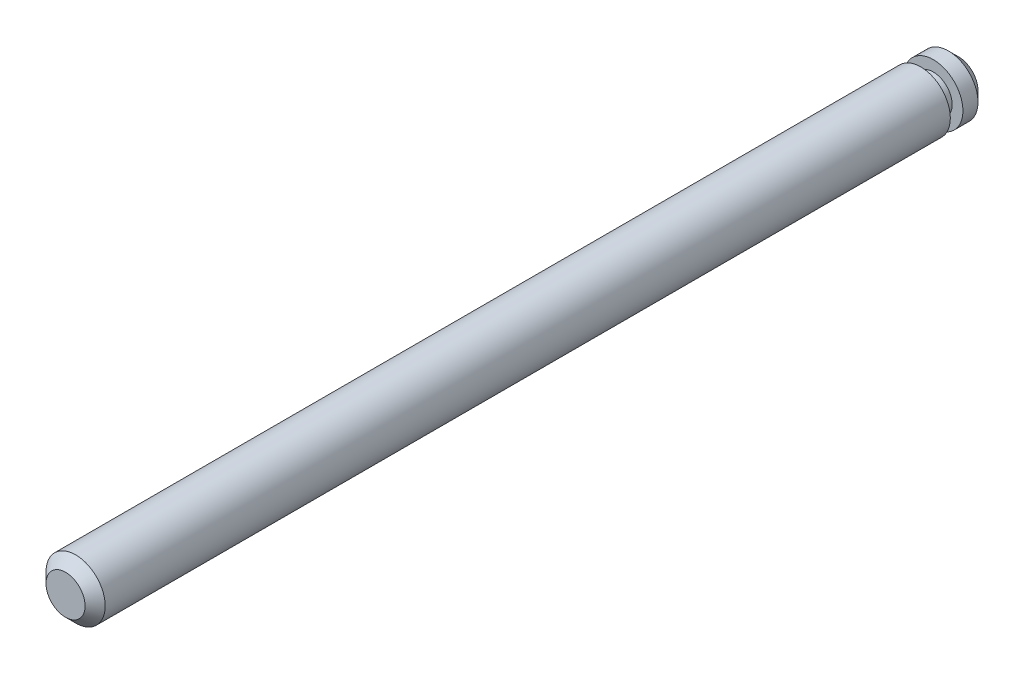
ISO-10303-21;
HEADER;
FILE_DESCRIPTION(('STEP AP214'),'2;1');
FILE_NAME('part.step','',(''),(''),'','','');
FILE_SCHEMA(('AUTOMOTIVE_DESIGN { 1 0 10303 214 1 1 1 1 }'));
ENDSEC;
DATA;
#1=APPLICATION_CONTEXT('core data for automotive mechanical design processes');
#2=APPLICATION_PROTOCOL_DEFINITION('international standard','automotive_design',2000,#1);
#3=PRODUCT_CONTEXT('',#1,'mechanical');
#4=PRODUCT('Part','Part','',(#3));
#5=PRODUCT_RELATED_PRODUCT_CATEGORY('part','',(#4));
#6=PRODUCT_DEFINITION_FORMATION('','',#4);
#7=PRODUCT_DEFINITION_CONTEXT('part definition',#1,'design');
#8=PRODUCT_DEFINITION('design','',#6,#7);
#9=PRODUCT_DEFINITION_SHAPE('','',#8);
#10=(LENGTH_UNIT() NAMED_UNIT(*) SI_UNIT(.MILLI.,.METRE.));
#11=(NAMED_UNIT(*) PLANE_ANGLE_UNIT() SI_UNIT($,.RADIAN.));
#12=(NAMED_UNIT(*) SI_UNIT($,.STERADIAN.) SOLID_ANGLE_UNIT());
#13=UNCERTAINTY_MEASURE_WITH_UNIT(LENGTH_MEASURE(1.E-05),#10,'distance_accuracy_value','');
#14=(GEOMETRIC_REPRESENTATION_CONTEXT(3) GLOBAL_UNCERTAINTY_ASSIGNED_CONTEXT((#13)) GLOBAL_UNIT_ASSIGNED_CONTEXT((#10,
#11,#12)) REPRESENTATION_CONTEXT('',''));
#15=CARTESIAN_POINT('',(0.,0.,0.));
#16=DIRECTION('',(0.,0.,1.));
#17=DIRECTION('',(1.,0.,0.));
#18=AXIS2_PLACEMENT_3D('',#15,#16,#17);
#19=CARTESIAN_POINT('',(0.,0.,0.));
#20=DIRECTION('',(0.,0.,1.));
#21=DIRECTION('',(1.,0.,0.));
#22=AXIS2_PLACEMENT_3D('',#19,#20,#21);
#23=PLANE('',#22);
#24=CARTESIAN_POINT('',(0.,0.,0.));
#25=DIRECTION('',(0.,0.,1.));
#26=DIRECTION('',(1.,0.,0.));
#27=AXIS2_PLACEMENT_3D('',#24,#25,#26);
#28=CIRCLE('',#27,1.49479);
#29=CARTESIAN_POINT('',(1.49479,0.,0.));
#30=VERTEX_POINT('',#29);
#31=EDGE_CURVE('E58',#30,#30,#28,.T.);
#32=ORIENTED_EDGE('',*,*,#31,.F.);
#33=EDGE_LOOP('',(#32));
#34=FACE_BOUND('',#33,.T.);
#35=CARTESIAN_POINT('',(0.,0.,0.));
#36=DIRECTION('',(0.,0.,1.));
#37=DIRECTION('',(1.,0.,0.));
#38=AXIS2_PLACEMENT_3D('',#35,#36,#37);
#39=CIRCLE('',#38,0.9525);
#40=CARTESIAN_POINT('',(0.9525,0.,0.));
#41=VERTEX_POINT('',#40);
#42=EDGE_CURVE('E55',#41,#41,#39,.F.);
#43=ORIENTED_EDGE('',*,*,#42,.F.);
#44=EDGE_LOOP('',(#43));
#45=FACE_BOUND('',#44,.T.);
#46=ADVANCED_FACE('F35',(#34,#45),#23,.F.);
#47=CARTESIAN_POINT('',(0.,0.,43.18));
#48=DIRECTION('',(0.,0.,-1.));
#49=DIRECTION('',(-1.,0.,0.));
#50=AXIS2_PLACEMENT_3D('',#47,#48,#49);
#51=CYLINDRICAL_SURFACE('',#50,1.49479);
#52=CARTESIAN_POINT('',(0.,0.,42.672));
#53=DIRECTION('',(0.,0.,1.));
#54=DIRECTION('',(1.,0.,0.));
#55=AXIS2_PLACEMENT_3D('',#52,#53,#54);
#56=CIRCLE('',#55,1.49479);
#57=CARTESIAN_POINT('',(1.49479,0.,42.672));
#58=VERTEX_POINT('',#57);
#59=EDGE_CURVE('E10',#58,#58,#56,.F.);
#60=ORIENTED_EDGE('',*,*,#59,.T.);
#61=EDGE_LOOP('',(#60));
#62=FACE_BOUND('',#61,.T.);
#63=ORIENTED_EDGE('',*,*,#31,.T.);
#64=EDGE_LOOP('',(#63));
#65=FACE_BOUND('',#64,.T.);
#66=ADVANCED_FACE('F84',(#62,#65),#51,.T.);
#67=CARTESIAN_POINT('',(0.,0.,43.18));
#68=DIRECTION('',(0.,0.,1.));
#69=DIRECTION('',(1.,0.,0.));
#70=AXIS2_PLACEMENT_3D('',#67,#68,#69);
#71=PLANE('',#70);
#72=CARTESIAN_POINT('',(0.,0.,43.18));
#73=DIRECTION('',(0.,0.,1.));
#74=DIRECTION('',(1.,0.,0.));
#75=AXIS2_PLACEMENT_3D('',#72,#73,#74);
#76=CIRCLE('',#75,0.986790000000001);
#77=CARTESIAN_POINT('',(0.986790000000001,0.,43.18));
#78=VERTEX_POINT('',#77);
#79=EDGE_CURVE('E42',#78,#78,#76,.T.);
#80=ORIENTED_EDGE('',*,*,#79,.T.);
#81=EDGE_LOOP('',(#80));
#82=FACE_BOUND('',#81,.T.);
#83=ADVANCED_FACE('F79',(#82),#71,.T.);
#84=CARTESIAN_POINT('',(0.,0.,-0.635));
#85=DIRECTION('',(0.,0.,1.));
#86=DIRECTION('',(1.,0.,0.));
#87=AXIS2_PLACEMENT_3D('',#84,#85,#86);
#88=CYLINDRICAL_SURFACE('',#87,0.9525);
#89=CARTESIAN_POINT('',(0.,0.,-0.635));
#90=DIRECTION('',(0.,0.,-1.));
#91=DIRECTION('',(-1.,0.,0.));
#92=AXIS2_PLACEMENT_3D('',#89,#90,#91);
#93=CIRCLE('',#92,0.9525);
#94=CARTESIAN_POINT('',(-0.9525,0.,-0.635));
#95=VERTEX_POINT('',#94);
#96=EDGE_CURVE('E61',#95,#95,#93,.T.);
#97=ORIENTED_EDGE('',*,*,#96,.F.);
#98=EDGE_LOOP('',(#97));
#99=FACE_BOUND('',#98,.T.);
#100=ORIENTED_EDGE('',*,*,#42,.T.);
#101=EDGE_LOOP('',(#100));
#102=FACE_BOUND('',#101,.T.);
#103=ADVANCED_FACE('F73',(#99,#102),#88,.T.);
#104=CARTESIAN_POINT('',(0.,0.,-0.635));
#105=DIRECTION('',(0.,0.,-1.));
#106=DIRECTION('',(-1.,0.,0.));
#107=AXIS2_PLACEMENT_3D('',#104,#105,#106);
#108=PLANE('',#107);
#109=CARTESIAN_POINT('',(0.,0.,-0.635));
#110=DIRECTION('',(0.,0.,-1.));
#111=DIRECTION('',(-1.,0.,0.));
#112=AXIS2_PLACEMENT_3D('',#109,#110,#111);
#113=CIRCLE('',#112,1.49479);
#114=CARTESIAN_POINT('',(-1.49479,0.,-0.635));
#115=VERTEX_POINT('',#114);
#116=EDGE_CURVE('E64',#115,#115,#113,.T.);
#117=ORIENTED_EDGE('',*,*,#116,.F.);
#118=EDGE_LOOP('',(#117));
#119=FACE_BOUND('',#118,.T.);
#120=ORIENTED_EDGE('',*,*,#96,.T.);
#121=EDGE_LOOP('',(#120));
#122=FACE_BOUND('',#121,.T.);
#123=ADVANCED_FACE('F70',(#119,#122),#108,.F.);
#124=CARTESIAN_POINT('',(0.,0.,-1.905));
#125=DIRECTION('',(0.,0.,1.));
#126=DIRECTION('',(1.,0.,0.));
#127=AXIS2_PLACEMENT_3D('',#124,#125,#126);
#128=CYLINDRICAL_SURFACE('',#127,1.49479);
#129=CARTESIAN_POINT('',(0.,0.,-1.397));
#130=DIRECTION('',(0.,0.,-1.));
#131=DIRECTION('',(-1.,0.,0.));
#132=AXIS2_PLACEMENT_3D('',#129,#130,#131);
#133=CIRCLE('',#132,1.49479);
#134=CARTESIAN_POINT('',(-1.49479,0.,-1.397));
#135=VERTEX_POINT('',#134);
#136=EDGE_CURVE('E46',#135,#135,#133,.F.);
#137=ORIENTED_EDGE('',*,*,#136,.T.);
#138=EDGE_LOOP('',(#137));
#139=FACE_BOUND('',#138,.T.);
#140=ORIENTED_EDGE('',*,*,#116,.T.);
#141=EDGE_LOOP('',(#140));
#142=FACE_BOUND('',#141,.T.);
#143=ADVANCED_FACE('F68',(#139,#142),#128,.T.);
#144=CARTESIAN_POINT('',(0.,0.,-1.905));
#145=DIRECTION('',(0.,0.,-1.));
#146=DIRECTION('',(-1.,0.,0.));
#147=AXIS2_PLACEMENT_3D('',#144,#145,#146);
#148=PLANE('',#147);
#149=CARTESIAN_POINT('',(0.,0.,-1.905));
#150=DIRECTION('',(0.,0.,-1.));
#151=DIRECTION('',(-1.,0.,0.));
#152=AXIS2_PLACEMENT_3D('',#149,#150,#151);
#153=CIRCLE('',#152,0.986790000000001);
#154=CARTESIAN_POINT('',(-0.986790000000001,0.,-1.905));
#155=VERTEX_POINT('',#154);
#156=EDGE_CURVE('E50',#155,#155,#153,.T.);
#157=ORIENTED_EDGE('',*,*,#156,.T.);
#158=EDGE_LOOP('',(#157));
#159=FACE_BOUND('',#158,.T.);
#160=ADVANCED_FACE('F95',(#159),#148,.T.);
#161=CARTESIAN_POINT('',(0.,0.,-1.905));
#162=DIRECTION('',(0.,0.,1.));
#163=DIRECTION('',(1.,0.,0.));
#164=AXIS2_PLACEMENT_3D('',#161,#162,#163);
#165=CONICAL_SURFACE('',#164,0.986790000000001,0.785398163397443);
#166=ORIENTED_EDGE('',*,*,#136,.F.);
#167=EDGE_LOOP('',(#166));
#168=FACE_BOUND('',#167,.T.);
#169=ORIENTED_EDGE('',*,*,#156,.F.);
#170=EDGE_LOOP('',(#169));
#171=FACE_BOUND('',#170,.T.);
#172=ADVANCED_FACE('F93',(#168,#171),#165,.T.);
#173=CARTESIAN_POINT('',(0.,0.,43.18));
#174=DIRECTION('',(0.,0.,-1.));
#175=DIRECTION('',(-1.,0.,0.));
#176=AXIS2_PLACEMENT_3D('',#173,#174,#175);
#177=CONICAL_SURFACE('',#176,0.986790000000001,0.785398163397445);
#178=ORIENTED_EDGE('',*,*,#59,.F.);
#179=EDGE_LOOP('',(#178));
#180=FACE_BOUND('',#179,.T.);
#181=ORIENTED_EDGE('',*,*,#79,.F.);
#182=EDGE_LOOP('',(#181));
#183=FACE_BOUND('',#182,.T.);
#184=ADVANCED_FACE('F37',(#180,#183),#177,.T.);
#185=CLOSED_SHELL('',(#46,#66,#83,#103,#123,#143,#160,#172,#184));
#186=MANIFOLD_SOLID_BREP('B2',#185);
#187=ADVANCED_BREP_SHAPE_REPRESENTATION('',(#18,#186),#14);
#188=SHAPE_DEFINITION_REPRESENTATION(#9,#187);
ENDSEC;
END-ISO-10303-21;
